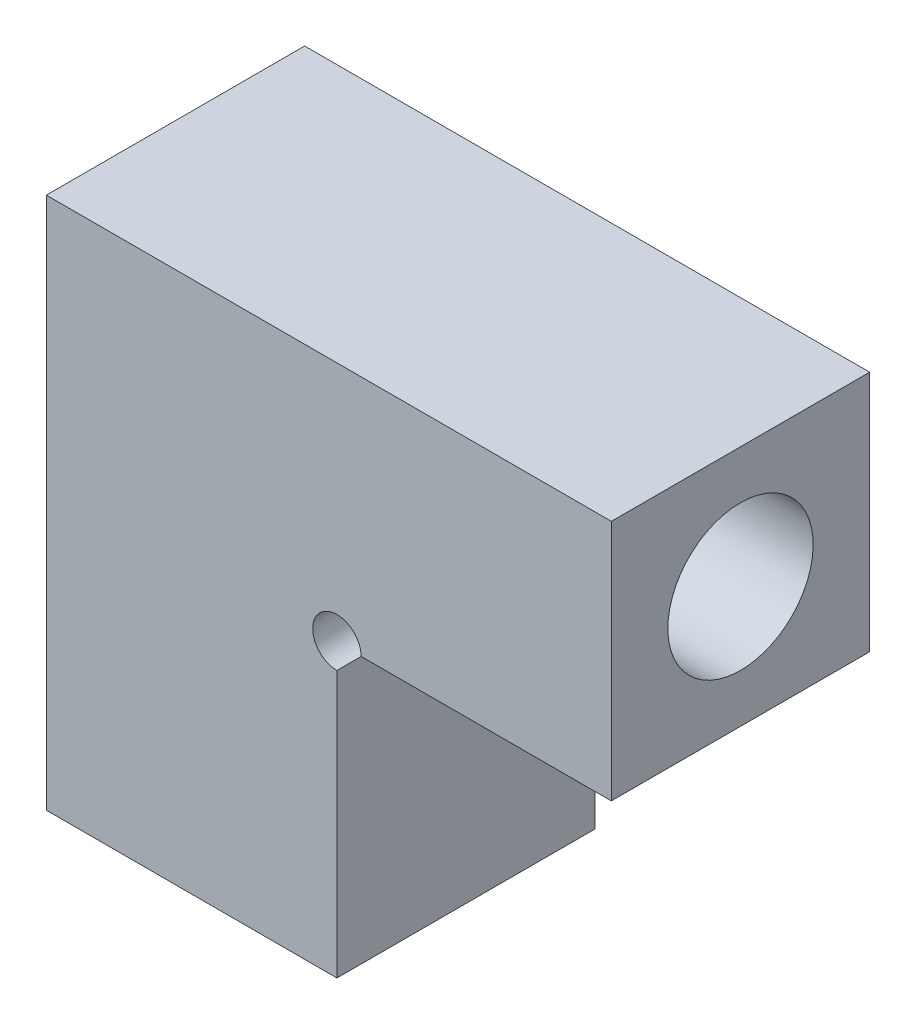
ISO-10303-21;
HEADER;
FILE_DESCRIPTION(('STEP AP214'),'2;1');
FILE_NAME('part.step','',(''),(''),'','','');
FILE_SCHEMA(('AUTOMOTIVE_DESIGN { 1 0 10303 214 1 1 1 1 }'));
ENDSEC;
DATA;
#1=APPLICATION_CONTEXT('core data for automotive mechanical design processes');
#2=APPLICATION_PROTOCOL_DEFINITION('international standard','automotive_design',2000,#1);
#3=PRODUCT_CONTEXT('',#1,'mechanical');
#4=PRODUCT('Part','Part','',(#3));
#5=PRODUCT_RELATED_PRODUCT_CATEGORY('part','',(#4));
#6=PRODUCT_DEFINITION_FORMATION('','',#4);
#7=PRODUCT_DEFINITION_CONTEXT('part definition',#1,'design');
#8=PRODUCT_DEFINITION('design','',#6,#7);
#9=PRODUCT_DEFINITION_SHAPE('','',#8);
#10=(LENGTH_UNIT() NAMED_UNIT(*) SI_UNIT(.MILLI.,.METRE.));
#11=(NAMED_UNIT(*) PLANE_ANGLE_UNIT() SI_UNIT($,.RADIAN.));
#12=(NAMED_UNIT(*) SI_UNIT($,.STERADIAN.) SOLID_ANGLE_UNIT());
#13=UNCERTAINTY_MEASURE_WITH_UNIT(LENGTH_MEASURE(1.E-05),#10,'distance_accuracy_value','');
#14=(GEOMETRIC_REPRESENTATION_CONTEXT(3) GLOBAL_UNCERTAINTY_ASSIGNED_CONTEXT((#13)) GLOBAL_UNIT_ASSIGNED_CONTEXT((#10,
#11,#12)) REPRESENTATION_CONTEXT('',''));
#15=CARTESIAN_POINT('',(0.,0.,0.));
#16=DIRECTION('',(0.,0.,1.));
#17=DIRECTION('',(1.,0.,0.));
#18=AXIS2_PLACEMENT_3D('',#15,#16,#17);
#19=CARTESIAN_POINT('',(18.,18.,16.));
#20=DIRECTION('',(0.,0.,-1.));
#21=DIRECTION('',(-1.,0.,0.));
#22=AXIS2_PLACEMENT_3D('',#19,#20,#21);
#23=CYLINDRICAL_SURFACE('',#22,1.5);
#24=CARTESIAN_POINT('',(18.,18.,0.));
#25=DIRECTION('',(0.,0.,1.));
#26=DIRECTION('',(1.,0.,0.));
#27=AXIS2_PLACEMENT_3D('',#24,#25,#26);
#28=CIRCLE('',#27,1.5);
#29=CARTESIAN_POINT('',(19.5,18.,0.));
#30=VERTEX_POINT('',#29);
#31=CARTESIAN_POINT('',(18.,16.5,0.));
#32=VERTEX_POINT('',#31);
#33=EDGE_CURVE('E148',#30,#32,#28,.T.);
#34=ORIENTED_EDGE('',*,*,#33,.F.);
#35=DIRECTION('',(0.,0.,-1.));
#36=VECTOR('',#35,1.);
#37=CARTESIAN_POINT('',(19.5,18.,16.));
#38=LINE('',#37,#36);
#39=CARTESIAN_POINT('',(19.5,18.,16.));
#40=VERTEX_POINT('',#39);
#41=EDGE_CURVE('E13',#40,#30,#38,.T.);
#42=ORIENTED_EDGE('',*,*,#41,.F.);
#43=CARTESIAN_POINT('',(18.,18.,16.));
#44=DIRECTION('',(0.,0.,1.));
#45=DIRECTION('',(1.,0.,0.));
#46=AXIS2_PLACEMENT_3D('',#43,#44,#45);
#47=CIRCLE('',#46,1.5);
#48=CARTESIAN_POINT('',(18.,16.5,16.));
#49=VERTEX_POINT('',#48);
#50=EDGE_CURVE('E173',#40,#49,#47,.T.);
#51=ORIENTED_EDGE('',*,*,#50,.T.);
#52=DIRECTION('',(0.,0.,-1.));
#53=VECTOR('',#52,1.);
#54=CARTESIAN_POINT('',(18.,16.5,16.));
#55=LINE('',#54,#53);
#56=EDGE_CURVE('E73',#49,#32,#55,.T.);
#57=ORIENTED_EDGE('',*,*,#56,.T.);
#58=EDGE_LOOP('',(#34,#42,#51,#57));
#59=FACE_BOUND('',#58,.T.);
#60=ADVANCED_FACE('F56',(#59),#23,.F.);
#61=CARTESIAN_POINT('',(0.,18.,16.));
#62=DIRECTION('',(0.,-1.,0.));
#63=DIRECTION('',(1.,0.,0.));
#64=AXIS2_PLACEMENT_3D('',#61,#62,#63);
#65=PLANE('',#64);
#66=DIRECTION('',(-1.,0.,0.));
#67=VECTOR('',#66,1.);
#68=CARTESIAN_POINT('',(0.,18.,0.));
#69=LINE('',#68,#67);
#70=CARTESIAN_POINT('',(35.,18.,0.));
#71=VERTEX_POINT('',#70);
#72=EDGE_CURVE('E151',#71,#30,#69,.T.);
#73=ORIENTED_EDGE('',*,*,#72,.F.);
#74=DIRECTION('',(0.,0.,-1.));
#75=VECTOR('',#74,1.);
#76=CARTESIAN_POINT('',(35.,18.,16.));
#77=LINE('',#76,#75);
#78=CARTESIAN_POINT('',(35.,18.,16.));
#79=VERTEX_POINT('',#78);
#80=EDGE_CURVE('E65',#79,#71,#77,.T.);
#81=ORIENTED_EDGE('',*,*,#80,.F.);
#82=DIRECTION('',(-1.,0.,0.));
#83=VECTOR('',#82,1.);
#84=CARTESIAN_POINT('',(0.,18.,16.));
#85=LINE('',#84,#83);
#86=EDGE_CURVE('E198',#79,#40,#85,.T.);
#87=ORIENTED_EDGE('',*,*,#86,.T.);
#88=ORIENTED_EDGE('',*,*,#41,.T.);
#89=EDGE_LOOP('',(#73,#81,#87,#88));
#90=FACE_BOUND('',#89,.T.);
#91=ADVANCED_FACE('F192',(#90),#65,.T.);
#92=CARTESIAN_POINT('',(35.,0.,16.));
#93=DIRECTION('',(1.,0.,0.));
#94=DIRECTION('',(0.,1.,0.));
#95=AXIS2_PLACEMENT_3D('',#92,#93,#94);
#96=PLANE('',#95);
#97=CARTESIAN_POINT('',(35.,25.5,8.));
#98=DIRECTION('',(1.,0.,0.));
#99=DIRECTION('',(0.,1.,0.));
#100=AXIS2_PLACEMENT_3D('',#97,#98,#99);
#101=CIRCLE('',#100,4.5);
#102=CARTESIAN_POINT('',(35.,30.,8.));
#103=VERTEX_POINT('',#102);
#104=EDGE_CURVE('E207',#103,#103,#101,.T.);
#105=ORIENTED_EDGE('',*,*,#104,.F.);
#106=EDGE_LOOP('',(#105));
#107=FACE_BOUND('',#106,.T.);
#108=DIRECTION('',(0.,-1.,0.));
#109=VECTOR('',#108,1.);
#110=CARTESIAN_POINT('',(35.,0.,0.));
#111=LINE('',#110,#109);
#112=CARTESIAN_POINT('',(35.,33.,0.));
#113=VERTEX_POINT('',#112);
#114=EDGE_CURVE('E156',#113,#71,#111,.T.);
#115=ORIENTED_EDGE('',*,*,#114,.F.);
#116=DIRECTION('',(0.,0.,-1.));
#117=VECTOR('',#116,1.);
#118=CARTESIAN_POINT('',(35.,33.,16.));
#119=LINE('',#118,#117);
#120=CARTESIAN_POINT('',(35.,33.,16.));
#121=VERTEX_POINT('',#120);
#122=EDGE_CURVE('E180',#121,#113,#119,.T.);
#123=ORIENTED_EDGE('',*,*,#122,.F.);
#124=DIRECTION('',(0.,-1.,0.));
#125=VECTOR('',#124,1.);
#126=CARTESIAN_POINT('',(35.,0.,16.));
#127=LINE('',#126,#125);
#128=EDGE_CURVE('E188',#121,#79,#127,.T.);
#129=ORIENTED_EDGE('',*,*,#128,.T.);
#130=ORIENTED_EDGE('',*,*,#80,.T.);
#131=EDGE_LOOP('',(#115,#123,#129,#130));
#132=FACE_BOUND('',#131,.T.);
#133=ADVANCED_FACE('F187',(#107,#132),#96,.T.);
#134=CARTESIAN_POINT('',(0.,33.,16.));
#135=DIRECTION('',(0.,1.,0.));
#136=DIRECTION('',(0.,0.,1.));
#137=AXIS2_PLACEMENT_3D('',#134,#135,#136);
#138=PLANE('',#137);
#139=DIRECTION('',(1.,0.,0.));
#140=VECTOR('',#139,1.);
#141=CARTESIAN_POINT('',(0.,33.,0.));
#142=LINE('',#141,#140);
#143=CARTESIAN_POINT('',(0.,33.,0.));
#144=VERTEX_POINT('',#143);
#145=EDGE_CURVE('E160',#144,#113,#142,.T.);
#146=ORIENTED_EDGE('',*,*,#145,.F.);
#147=DIRECTION('',(0.,0.,-1.));
#148=VECTOR('',#147,1.);
#149=CARTESIAN_POINT('',(0.,33.,16.));
#150=LINE('',#149,#148);
#151=CARTESIAN_POINT('',(0.,33.,16.));
#152=VERTEX_POINT('',#151);
#153=EDGE_CURVE('E127',#152,#144,#150,.T.);
#154=ORIENTED_EDGE('',*,*,#153,.F.);
#155=DIRECTION('',(1.,0.,0.));
#156=VECTOR('',#155,1.);
#157=CARTESIAN_POINT('',(0.,33.,16.));
#158=LINE('',#157,#156);
#159=EDGE_CURVE('E137',#152,#121,#158,.T.);
#160=ORIENTED_EDGE('',*,*,#159,.T.);
#161=ORIENTED_EDGE('',*,*,#122,.T.);
#162=EDGE_LOOP('',(#146,#154,#160,#161));
#163=FACE_BOUND('',#162,.T.);
#164=ADVANCED_FACE('F197',(#163),#138,.T.);
#165=CARTESIAN_POINT('',(0.,0.,16.));
#166=DIRECTION('',(-1.,0.,0.));
#167=DIRECTION('',(0.,0.,1.));
#168=AXIS2_PLACEMENT_3D('',#165,#166,#167);
#169=PLANE('',#168);
#170=CARTESIAN_POINT('',(0.,25.5,8.));
#171=DIRECTION('',(1.,0.,0.));
#172=DIRECTION('',(0.,1.,0.));
#173=AXIS2_PLACEMENT_3D('',#170,#171,#172);
#174=CIRCLE('',#173,4.5);
#175=CARTESIAN_POINT('',(0.,30.,8.));
#176=VERTEX_POINT('',#175);
#177=EDGE_CURVE('E152',#176,#176,#174,.T.);
#178=ORIENTED_EDGE('',*,*,#177,.T.);
#179=EDGE_LOOP('',(#178));
#180=FACE_BOUND('',#179,.T.);
#181=DIRECTION('',(0.,1.,0.));
#182=VECTOR('',#181,1.);
#183=CARTESIAN_POINT('',(0.,0.,0.));
#184=LINE('',#183,#182);
#185=CARTESIAN_POINT('',(0.,0.,0.));
#186=VERTEX_POINT('',#185);
#187=EDGE_CURVE('E122',#186,#144,#184,.T.);
#188=ORIENTED_EDGE('',*,*,#187,.F.);
#189=DIRECTION('',(0.,0.,-1.));
#190=VECTOR('',#189,1.);
#191=CARTESIAN_POINT('',(0.,0.,16.));
#192=LINE('',#191,#190);
#193=CARTESIAN_POINT('',(0.,0.,16.));
#194=VERTEX_POINT('',#193);
#195=EDGE_CURVE('E117',#194,#186,#192,.T.);
#196=ORIENTED_EDGE('',*,*,#195,.F.);
#197=DIRECTION('',(0.,1.,0.));
#198=VECTOR('',#197,1.);
#199=CARTESIAN_POINT('',(0.,0.,16.));
#200=LINE('',#199,#198);
#201=EDGE_CURVE('E120',#194,#152,#200,.T.);
#202=ORIENTED_EDGE('',*,*,#201,.T.);
#203=ORIENTED_EDGE('',*,*,#153,.T.);
#204=EDGE_LOOP('',(#188,#196,#202,#203));
#205=FACE_BOUND('',#204,.T.);
#206=ADVANCED_FACE('F119',(#180,#205),#169,.T.);
#207=CARTESIAN_POINT('',(0.,0.,16.));
#208=DIRECTION('',(0.,-1.,0.));
#209=DIRECTION('',(0.,0.,-1.));
#210=AXIS2_PLACEMENT_3D('',#207,#208,#209);
#211=PLANE('',#210);
#212=DIRECTION('',(-1.,0.,0.));
#213=VECTOR('',#212,1.);
#214=CARTESIAN_POINT('',(0.,0.,0.));
#215=LINE('',#214,#213);
#216=CARTESIAN_POINT('',(18.,0.,0.));
#217=VERTEX_POINT('',#216);
#218=EDGE_CURVE('E166',#217,#186,#215,.T.);
#219=ORIENTED_EDGE('',*,*,#218,.F.);
#220=DIRECTION('',(0.,0.,-1.));
#221=VECTOR('',#220,1.);
#222=CARTESIAN_POINT('',(18.,0.,16.));
#223=LINE('',#222,#221);
#224=CARTESIAN_POINT('',(18.,0.,16.));
#225=VERTEX_POINT('',#224);
#226=EDGE_CURVE('E95',#225,#217,#223,.T.);
#227=ORIENTED_EDGE('',*,*,#226,.F.);
#228=DIRECTION('',(-1.,0.,0.));
#229=VECTOR('',#228,1.);
#230=CARTESIAN_POINT('',(0.,0.,16.));
#231=LINE('',#230,#229);
#232=EDGE_CURVE('E134',#225,#194,#231,.T.);
#233=ORIENTED_EDGE('',*,*,#232,.T.);
#234=ORIENTED_EDGE('',*,*,#195,.T.);
#235=EDGE_LOOP('',(#219,#227,#233,#234));
#236=FACE_BOUND('',#235,.T.);
#237=ADVANCED_FACE('F140',(#236),#211,.T.);
#238=CARTESIAN_POINT('',(18.,0.,16.));
#239=DIRECTION('',(1.,0.,0.));
#240=DIRECTION('',(0.,1.,0.));
#241=AXIS2_PLACEMENT_3D('',#238,#239,#240);
#242=PLANE('',#241);
#243=DIRECTION('',(0.,-1.,0.));
#244=VECTOR('',#243,1.);
#245=CARTESIAN_POINT('',(18.,0.,0.));
#246=LINE('',#245,#244);
#247=EDGE_CURVE('E169',#32,#217,#246,.T.);
#248=ORIENTED_EDGE('',*,*,#247,.F.);
#249=ORIENTED_EDGE('',*,*,#56,.F.);
#250=DIRECTION('',(0.,-1.,0.));
#251=VECTOR('',#250,1.);
#252=CARTESIAN_POINT('',(18.,0.,16.));
#253=LINE('',#252,#251);
#254=EDGE_CURVE('E142',#49,#225,#253,.T.);
#255=ORIENTED_EDGE('',*,*,#254,.T.);
#256=ORIENTED_EDGE('',*,*,#226,.T.);
#257=EDGE_LOOP('',(#248,#249,#255,#256));
#258=FACE_BOUND('',#257,.T.);
#259=ADVANCED_FACE('F232',(#258),#242,.T.);
#260=CARTESIAN_POINT('',(0.,0.,16.));
#261=DIRECTION('',(0.,0.,1.));
#262=DIRECTION('',(1.,0.,0.));
#263=AXIS2_PLACEMENT_3D('',#260,#261,#262);
#264=PLANE('',#263);
#265=ORIENTED_EDGE('',*,*,#50,.F.);
#266=ORIENTED_EDGE('',*,*,#86,.F.);
#267=ORIENTED_EDGE('',*,*,#128,.F.);
#268=ORIENTED_EDGE('',*,*,#159,.F.);
#269=ORIENTED_EDGE('',*,*,#201,.F.);
#270=ORIENTED_EDGE('',*,*,#232,.F.);
#271=ORIENTED_EDGE('',*,*,#254,.F.);
#272=EDGE_LOOP('',(#265,#266,#267,#268,#269,#270,#271));
#273=FACE_BOUND('',#272,.T.);
#274=ADVANCED_FACE('F132',(#273),#264,.T.);
#275=CARTESIAN_POINT('',(0.,0.,0.));
#276=DIRECTION('',(0.,0.,1.));
#277=DIRECTION('',(1.,0.,0.));
#278=AXIS2_PLACEMENT_3D('',#275,#276,#277);
#279=PLANE('',#278);
#280=ORIENTED_EDGE('',*,*,#33,.T.);
#281=ORIENTED_EDGE('',*,*,#247,.T.);
#282=ORIENTED_EDGE('',*,*,#218,.T.);
#283=ORIENTED_EDGE('',*,*,#187,.T.);
#284=ORIENTED_EDGE('',*,*,#145,.T.);
#285=ORIENTED_EDGE('',*,*,#114,.T.);
#286=ORIENTED_EDGE('',*,*,#72,.T.);
#287=EDGE_LOOP('',(#280,#281,#282,#283,#284,#285,#286));
#288=FACE_BOUND('',#287,.T.);
#289=ADVANCED_FACE('F194',(#288),#279,.F.);
#290=CARTESIAN_POINT('',(0.,25.5,8.));
#291=DIRECTION('',(1.,0.,0.));
#292=DIRECTION('',(0.,1.,0.));
#293=AXIS2_PLACEMENT_3D('',#290,#291,#292);
#294=CYLINDRICAL_SURFACE('',#293,4.5);
#295=ORIENTED_EDGE('',*,*,#177,.F.);
#296=EDGE_LOOP('',(#295));
#297=FACE_BOUND('',#296,.T.);
#298=ORIENTED_EDGE('',*,*,#104,.T.);
#299=EDGE_LOOP('',(#298));
#300=FACE_BOUND('',#299,.T.);
#301=ADVANCED_FACE('F216',(#297,#300),#294,.F.);
#302=CLOSED_SHELL('',(#60,#91,#133,#164,#206,#237,#259,#274,#289,#301));
#303=MANIFOLD_SOLID_BREP('B2',#302);
#304=ADVANCED_BREP_SHAPE_REPRESENTATION('',(#18,#303),#14);
#305=SHAPE_DEFINITION_REPRESENTATION(#9,#304);
ENDSEC;
END-ISO-10303-21;
